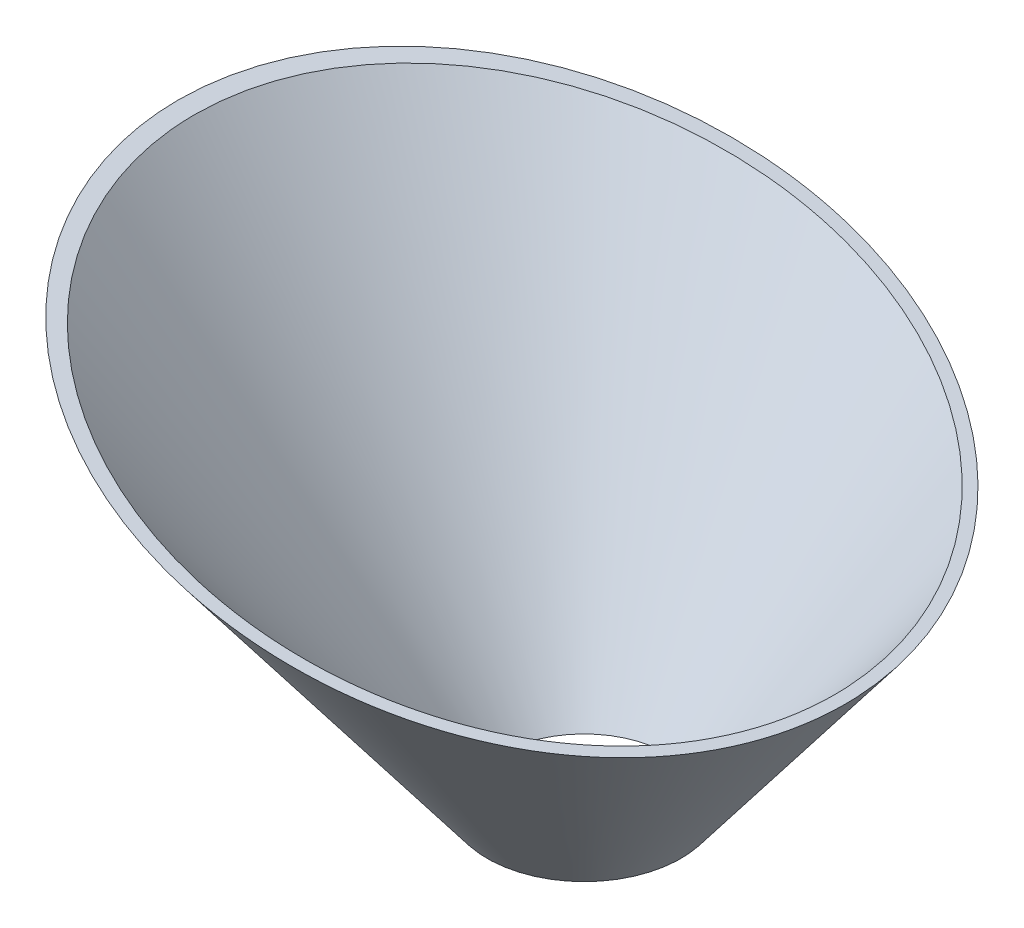
ISO-10303-21;
HEADER;
FILE_DESCRIPTION(('STEP AP214'),'2;1');
FILE_NAME('part.step','',(''),(''),'','','');
FILE_SCHEMA(('AUTOMOTIVE_DESIGN { 1 0 10303 214 1 1 1 1 }'));
ENDSEC;
DATA;
#1=APPLICATION_CONTEXT('core data for automotive mechanical design processes');
#2=APPLICATION_PROTOCOL_DEFINITION('international standard','automotive_design',2000,#1);
#3=PRODUCT_CONTEXT('',#1,'mechanical');
#4=PRODUCT('Part','Part','',(#3));
#5=PRODUCT_RELATED_PRODUCT_CATEGORY('part','',(#4));
#6=PRODUCT_DEFINITION_FORMATION('','',#4);
#7=PRODUCT_DEFINITION_CONTEXT('part definition',#1,'design');
#8=PRODUCT_DEFINITION('design','',#6,#7);
#9=PRODUCT_DEFINITION_SHAPE('','',#8);
#10=(LENGTH_UNIT() NAMED_UNIT(*) SI_UNIT(.MILLI.,.METRE.));
#11=(NAMED_UNIT(*) PLANE_ANGLE_UNIT() SI_UNIT($,.RADIAN.));
#12=(NAMED_UNIT(*) SI_UNIT($,.STERADIAN.) SOLID_ANGLE_UNIT());
#13=UNCERTAINTY_MEASURE_WITH_UNIT(LENGTH_MEASURE(1.E-05),#10,'distance_accuracy_value','');
#14=(GEOMETRIC_REPRESENTATION_CONTEXT(3) GLOBAL_UNCERTAINTY_ASSIGNED_CONTEXT((#13)) GLOBAL_UNIT_ASSIGNED_CONTEXT((#10,
#11,#12)) REPRESENTATION_CONTEXT('',''));
#15=CARTESIAN_POINT('',(0.,0.,0.));
#16=DIRECTION('',(0.,0.,1.));
#17=DIRECTION('',(1.,0.,0.));
#18=AXIS2_PLACEMENT_3D('',#15,#16,#17);
#19=CARTESIAN_POINT('',(0.,0.,0.));
#20=DIRECTION('',(0.,1.,0.));
#21=DIRECTION('',(0.,0.,1.));
#22=AXIS2_PLACEMENT_3D('',#19,#20,#21);
#23=PLANE('',#22);
#24=CARTESIAN_POINT('',(0.,0.,0.));
#25=DIRECTION('',(0.,1.,0.));
#26=DIRECTION('',(0.,0.,1.));
#27=AXIS2_PLACEMENT_3D('',#24,#25,#26);
#28=CIRCLE('',#27,21.064773147061);
#29=CARTESIAN_POINT('',(0.,0.,21.064773147061));
#30=VERTEX_POINT('',#29);
#31=EDGE_CURVE('E39',#30,#30,#28,.F.);
#32=ORIENTED_EDGE('',*,*,#31,.F.);
#33=EDGE_LOOP('',(#32));
#34=FACE_BOUND('',#33,.T.);
#35=CARTESIAN_POINT('',(0.,0.,0.));
#36=DIRECTION('',(0.,-1.,0.));
#37=DIRECTION('',(0.,0.,-1.));
#38=AXIS2_PLACEMENT_3D('',#35,#36,#37);
#39=CIRCLE('',#38,24.257);
#40=CARTESIAN_POINT('',(0.,0.,-24.257));
#41=VERTEX_POINT('',#40);
#42=EDGE_CURVE('E10',#41,#41,#39,.T.);
#43=ORIENTED_EDGE('',*,*,#42,.T.);
#44=EDGE_LOOP('',(#43));
#45=FACE_BOUND('',#44,.T.);
#46=ADVANCED_FACE('F32',(#34,#45),#23,.F.);
#47=CARTESIAN_POINT('',(0.,101.6,0.));
#48=DIRECTION('',(0.,1.,0.));
#49=DIRECTION('',(0.,0.,1.));
#50=AXIS2_PLACEMENT_3D('',#47,#48,#49);
#51=CONICAL_SURFACE('',#50,101.6,0.650662315199365);
#52=ORIENTED_EDGE('',*,*,#42,.F.);
#53=EDGE_LOOP('',(#52));
#54=FACE_BOUND('',#53,.T.);
#55=CARTESIAN_POINT('',(-18.079221321646,77.8506123853583,0.));
#56=DIRECTION('',(-0.273510391320029,-0.961869048176499,0.));
#57=DIRECTION('',(-0.961869048176499,0.273510391320029,0.));
#58=AXIS2_PLACEMENT_3D('',#55,#56,#57);
#59=ELLIPSE('',#58,86.8317561904001,81.5405557219322);
#60=CARTESIAN_POINT('',(-101.6,101.6,0.));
#61=VERTEX_POINT('',#60);
#62=EDGE_CURVE('E43',#61,#61,#59,.T.);
#63=ORIENTED_EDGE('',*,*,#62,.T.);
#64=EDGE_LOOP('',(#63));
#65=FACE_BOUND('',#64,.T.);
#66=ADVANCED_FACE('F58',(#54,#65),#51,.T.);
#67=CARTESIAN_POINT('',(0.,103.138512369658,0.));
#68=DIRECTION('',(0.,1.,0.));
#69=DIRECTION('',(0.,0.,1.));
#70=AXIS2_PLACEMENT_3D('',#67,#68,#69);
#71=CONICAL_SURFACE('',#70,99.5789656884629,0.650662315199365);
#72=CARTESIAN_POINT('',(-17.3542502645887,77.6444646588176,0.));
#73=DIRECTION('',(-0.273510391320029,-0.961869048176499,0.));
#74=DIRECTION('',(-0.961869048176499,0.273510391320029,0.));
#75=AXIS2_PLACEMENT_3D('',#72,#73,#74);
#76=ELLIPSE('',#75,83.3498302295665,78.2708052264287);
#77=CARTESIAN_POINT('',(-97.5258721331746,100.441509341364,0.));
#78=VERTEX_POINT('',#77);
#79=EDGE_CURVE('E35',#78,#78,#76,.T.);
#80=ORIENTED_EDGE('',*,*,#79,.F.);
#81=EDGE_LOOP('',(#80));
#82=FACE_BOUND('',#81,.T.);
#83=ORIENTED_EDGE('',*,*,#31,.T.);
#84=EDGE_LOOP('',(#83));
#85=FACE_BOUND('',#84,.T.);
#86=ADVANCED_FACE('F55',(#82,#85),#71,.F.);
#87=CARTESIAN_POINT('',(65.441557356708,54.1012247707166,-101.6));
#88=DIRECTION('',(-0.273510391320029,-0.961869048176499,0.));
#89=DIRECTION('',(0.961869048176499,-0.273510391320029,0.));
#90=AXIS2_PLACEMENT_3D('',#87,#88,#89);
#91=PLANE('',#90);
#92=ORIENTED_EDGE('',*,*,#79,.T.);
#93=EDGE_LOOP('',(#92));
#94=FACE_BOUND('',#93,.T.);
#95=ORIENTED_EDGE('',*,*,#62,.F.);
#96=EDGE_LOOP('',(#95));
#97=FACE_BOUND('',#96,.T.);
#98=ADVANCED_FACE('F52',(#94,#97),#91,.F.);
#99=CLOSED_SHELL('',(#46,#66,#86,#98));
#100=MANIFOLD_SOLID_BREP('B2',#99);
#101=ADVANCED_BREP_SHAPE_REPRESENTATION('',(#18,#100),#14);
#102=SHAPE_DEFINITION_REPRESENTATION(#9,#101);
ENDSEC;
END-ISO-10303-21;
